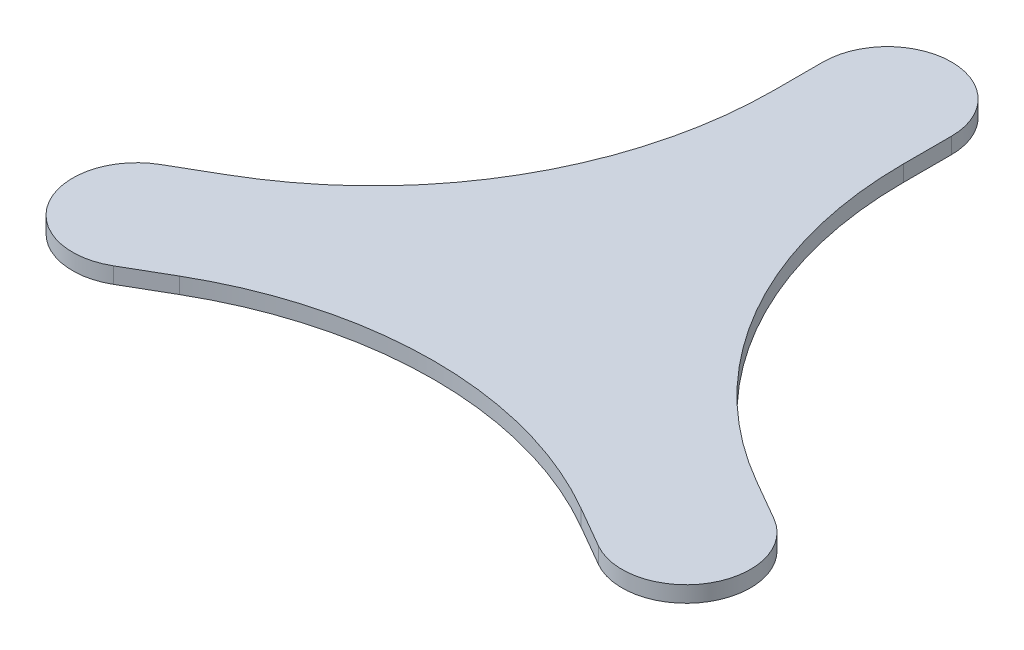
ISO-10303-21;
HEADER;
FILE_DESCRIPTION(('STEP AP214'),'2;1');
FILE_NAME('part.step','',(''),(''),'','','');
FILE_SCHEMA(('AUTOMOTIVE_DESIGN { 1 0 10303 214 1 1 1 1 }'));
ENDSEC;
DATA;
#1=APPLICATION_CONTEXT('core data for automotive mechanical design processes');
#2=APPLICATION_PROTOCOL_DEFINITION('international standard','automotive_design',2000,#1);
#3=PRODUCT_CONTEXT('',#1,'mechanical');
#4=PRODUCT('Part','Part','',(#3));
#5=PRODUCT_RELATED_PRODUCT_CATEGORY('part','',(#4));
#6=PRODUCT_DEFINITION_FORMATION('','',#4);
#7=PRODUCT_DEFINITION_CONTEXT('part definition',#1,'design');
#8=PRODUCT_DEFINITION('design','',#6,#7);
#9=PRODUCT_DEFINITION_SHAPE('','',#8);
#10=(LENGTH_UNIT() NAMED_UNIT(*) SI_UNIT(.MILLI.,.METRE.));
#11=(NAMED_UNIT(*) PLANE_ANGLE_UNIT() SI_UNIT($,.RADIAN.));
#12=(NAMED_UNIT(*) SI_UNIT($,.STERADIAN.) SOLID_ANGLE_UNIT());
#13=UNCERTAINTY_MEASURE_WITH_UNIT(LENGTH_MEASURE(1.E-05),#10,'distance_accuracy_value','');
#14=(GEOMETRIC_REPRESENTATION_CONTEXT(3) GLOBAL_UNCERTAINTY_ASSIGNED_CONTEXT((#13)) GLOBAL_UNIT_ASSIGNED_CONTEXT((#10,
#11,#12)) REPRESENTATION_CONTEXT('',''));
#15=CARTESIAN_POINT('',(0.,0.,0.));
#16=DIRECTION('',(0.,0.,1.));
#17=DIRECTION('',(1.,0.,0.));
#18=AXIS2_PLACEMENT_3D('',#15,#16,#17);
#19=CARTESIAN_POINT('',(-124.999999999999,10.,118.356805183872));
#20=DIRECTION('',(0.499999999999996,0.,0.866025403784441));
#21=DIRECTION('',(0.866025403784441,0.,-0.499999999999996));
#22=AXIS2_PLACEMENT_3D('',#19,#20,#21);
#23=PLANE('',#22);
#24=DIRECTION('',(-0.866025403784441,0.,0.499999999999996));
#25=VECTOR('',#24,1.);
#26=CARTESIAN_POINT('',(-124.999999999999,0.,118.356805183872));
#27=LINE('',#26,#25);
#28=CARTESIAN_POINT('',(-124.999999999999,0.,118.356805183872));
#29=VERTEX_POINT('',#28);
#30=CARTESIAN_POINT('',(-151.040017247427,0.,133.391016151377));
#31=VERTEX_POINT('',#30);
#32=EDGE_CURVE('E159',#29,#31,#27,.T.);
#33=ORIENTED_EDGE('',*,*,#32,.F.);
#34=DIRECTION('',(0.,-1.,0.));
#35=VECTOR('',#34,1.);
#36=CARTESIAN_POINT('',(-124.999999999999,10.,118.356805183872));
#37=LINE('',#36,#35);
#38=CARTESIAN_POINT('',(-124.999999999999,10.,118.356805183872));
#39=VERTEX_POINT('',#38);
#40=EDGE_CURVE('E11',#39,#29,#37,.T.);
#41=ORIENTED_EDGE('',*,*,#40,.F.);
#42=DIRECTION('',(-0.866025403784441,0.,0.499999999999996));
#43=VECTOR('',#42,1.);
#44=CARTESIAN_POINT('',(-124.999999999999,10.,118.356805183872));
#45=LINE('',#44,#43);
#46=CARTESIAN_POINT('',(-151.040017247427,10.,133.391016151377));
#47=VERTEX_POINT('',#46);
#48=EDGE_CURVE('E185',#39,#47,#45,.T.);
#49=ORIENTED_EDGE('',*,*,#48,.T.);
#50=DIRECTION('',(0.,-1.,0.));
#51=VECTOR('',#50,1.);
#52=CARTESIAN_POINT('',(-151.040017247427,10.,133.391016151377));
#53=LINE('',#52,#51);
#54=EDGE_CURVE('E40',#47,#31,#53,.T.);
#55=ORIENTED_EDGE('',*,*,#54,.T.);
#56=EDGE_LOOP('',(#33,#41,#49,#55));
#57=FACE_BOUND('',#56,.T.);
#58=ADVANCED_FACE('F37',(#57),#23,.T.);
#59=CARTESIAN_POINT('',(0.,10.,334.863156129982));
#60=DIRECTION('',(0.,-1.,0.));
#61=DIRECTION('',(0.,0.,-1.));
#62=AXIS2_PLACEMENT_3D('',#59,#60,#61);
#63=CYLINDRICAL_SURFACE('',#62,250.);
#64=CARTESIAN_POINT('',(0.,0.,334.863156129982));
#65=DIRECTION('',(0.,-1.,0.));
#66=DIRECTION('',(0.,0.,-1.));
#67=AXIS2_PLACEMENT_3D('',#64,#65,#66);
#68=CIRCLE('',#67,250.);
#69=CARTESIAN_POINT('',(125.,0.,118.356805183873));
#70=VERTEX_POINT('',#69);
#71=EDGE_CURVE('E94',#29,#70,#68,.T.);
#72=ORIENTED_EDGE('',*,*,#71,.T.);
#73=DIRECTION('',(0.,-1.,0.));
#74=VECTOR('',#73,1.);
#75=CARTESIAN_POINT('',(125.,10.,118.356805183873));
#76=LINE('',#75,#74);
#77=CARTESIAN_POINT('',(125.,10.,118.356805183873));
#78=VERTEX_POINT('',#77);
#79=EDGE_CURVE('E46',#78,#70,#76,.T.);
#80=ORIENTED_EDGE('',*,*,#79,.F.);
#81=CARTESIAN_POINT('',(0.,10.,334.863156129982));
#82=DIRECTION('',(0.,-1.,0.));
#83=DIRECTION('',(0.,0.,-1.));
#84=AXIS2_PLACEMENT_3D('',#81,#82,#83);
#85=CIRCLE('',#84,250.);
#86=EDGE_CURVE('E137',#39,#78,#85,.T.);
#87=ORIENTED_EDGE('',*,*,#86,.F.);
#88=ORIENTED_EDGE('',*,*,#40,.T.);
#89=EDGE_LOOP('',(#72,#80,#87,#88));
#90=FACE_BOUND('',#89,.T.);
#91=ADVANCED_FACE('F264',(#90),#63,.F.);
#92=CARTESIAN_POINT('',(125.000000000001,10.,118.356805183873));
#93=DIRECTION('',(0.500000000000003,0.,-0.866025403784437));
#94=DIRECTION('',(-0.866025403784437,0.,-0.500000000000003));
#95=AXIS2_PLACEMENT_3D('',#92,#93,#94);
#96=PLANE('',#95);
#97=DIRECTION('',(0.866025403784437,0.,0.500000000000003));
#98=VECTOR('',#97,1.);
#99=CARTESIAN_POINT('',(125.000000000001,0.,118.356805183873));
#100=LINE('',#99,#98);
#101=CARTESIAN_POINT('',(151.040017247427,0.,133.391016151377));
#102=VERTEX_POINT('',#101);
#103=EDGE_CURVE('E144',#70,#102,#100,.T.);
#104=ORIENTED_EDGE('',*,*,#103,.T.);
#105=DIRECTION('',(0.,-1.,0.));
#106=VECTOR('',#105,1.);
#107=CARTESIAN_POINT('',(151.040017247427,10.,133.391016151377));
#108=LINE('',#107,#106);
#109=CARTESIAN_POINT('',(151.040017247427,10.,133.391016151377));
#110=VERTEX_POINT('',#109);
#111=EDGE_CURVE('E141',#110,#102,#108,.T.);
#112=ORIENTED_EDGE('',*,*,#111,.F.);
#113=DIRECTION('',(0.866025403784437,0.,0.500000000000003));
#114=VECTOR('',#113,1.);
#115=CARTESIAN_POINT('',(125.000000000001,10.,118.356805183873));
#116=LINE('',#115,#114);
#117=EDGE_CURVE('E130',#78,#110,#116,.T.);
#118=ORIENTED_EDGE('',*,*,#117,.F.);
#119=ORIENTED_EDGE('',*,*,#79,.T.);
#120=EDGE_LOOP('',(#104,#112,#118,#119));
#121=FACE_BOUND('',#120,.T.);
#122=ADVANCED_FACE('F142',(#121),#96,.F.);
#123=CARTESIAN_POINT('',(171.040017247427,10.,98.7499999999995));
#124=DIRECTION('',(0.,-1.,0.));
#125=DIRECTION('',(0.,0.,-1.));
#126=AXIS2_PLACEMENT_3D('',#123,#124,#125);
#127=CYLINDRICAL_SURFACE('',#126,40.0000000000001);
#128=CARTESIAN_POINT('',(171.040017247427,0.,98.7499999999995));
#129=DIRECTION('',(0.,1.,0.));
#130=DIRECTION('',(0.,0.,1.));
#131=AXIS2_PLACEMENT_3D('',#128,#129,#130);
#132=CIRCLE('',#131,40.0000000000001);
#133=CARTESIAN_POINT('',(191.040017247427,0.,64.1089838486219));
#134=VERTEX_POINT('',#133);
#135=EDGE_CURVE('E182',#102,#134,#132,.T.);
#136=ORIENTED_EDGE('',*,*,#135,.T.);
#137=DIRECTION('',(0.,-1.,0.));
#138=VECTOR('',#137,1.);
#139=CARTESIAN_POINT('',(191.040017247427,10.,64.1089838486219));
#140=LINE('',#139,#138);
#141=CARTESIAN_POINT('',(191.040017247427,10.,64.1089838486219));
#142=VERTEX_POINT('',#141);
#143=EDGE_CURVE('E148',#142,#134,#140,.T.);
#144=ORIENTED_EDGE('',*,*,#143,.F.);
#145=CARTESIAN_POINT('',(171.040017247427,10.,98.7499999999995));
#146=DIRECTION('',(0.,1.,0.));
#147=DIRECTION('',(0.,0.,1.));
#148=AXIS2_PLACEMENT_3D('',#145,#146,#147);
#149=CIRCLE('',#148,40.0000000000001);
#150=EDGE_CURVE('E135',#110,#142,#149,.T.);
#151=ORIENTED_EDGE('',*,*,#150,.F.);
#152=ORIENTED_EDGE('',*,*,#111,.T.);
#153=EDGE_LOOP('',(#136,#144,#151,#152));
#154=FACE_BOUND('',#153,.T.);
#155=ADVANCED_FACE('F150',(#154),#127,.T.);
#156=CARTESIAN_POINT('',(165.000000000001,10.,49.074772881118));
#157=DIRECTION('',(0.499999999999996,0.,-0.866025403784441));
#158=DIRECTION('',(-0.866025403784441,0.,-0.499999999999996));
#159=AXIS2_PLACEMENT_3D('',#156,#157,#158);
#160=PLANE('',#159);
#161=DIRECTION('',(0.866025403784441,0.,0.499999999999996));
#162=VECTOR('',#161,1.);
#163=CARTESIAN_POINT('',(165.000000000001,0.,49.074772881118));
#164=LINE('',#163,#162);
#165=CARTESIAN_POINT('',(165.000000000001,0.,49.074772881118));
#166=VERTEX_POINT('',#165);
#167=EDGE_CURVE('E179',#166,#134,#164,.T.);
#168=ORIENTED_EDGE('',*,*,#167,.F.);
#169=DIRECTION('',(0.,-1.,0.));
#170=VECTOR('',#169,1.);
#171=CARTESIAN_POINT('',(165.000000000001,10.,49.074772881118));
#172=LINE('',#171,#170);
#173=CARTESIAN_POINT('',(165.000000000001,10.,49.074772881118));
#174=VERTEX_POINT('',#173);
#175=EDGE_CURVE('E189',#174,#166,#172,.T.);
#176=ORIENTED_EDGE('',*,*,#175,.F.);
#177=DIRECTION('',(0.866025403784441,0.,0.499999999999996));
#178=VECTOR('',#177,1.);
#179=CARTESIAN_POINT('',(165.000000000001,10.,49.074772881118));
#180=LINE('',#179,#178);
#181=EDGE_CURVE('E152',#174,#142,#180,.T.);
#182=ORIENTED_EDGE('',*,*,#181,.T.);
#183=ORIENTED_EDGE('',*,*,#143,.T.);
#184=EDGE_LOOP('',(#168,#176,#182,#183));
#185=FACE_BOUND('',#184,.T.);
#186=ADVANCED_FACE('F215',(#185),#160,.T.);
#187=CARTESIAN_POINT('',(290.,10.,-167.431578064992));
#188=DIRECTION('',(0.,-1.,0.));
#189=DIRECTION('',(0.,0.,-1.));
#190=AXIS2_PLACEMENT_3D('',#187,#188,#189);
#191=CYLINDRICAL_SURFACE('',#190,250.);
#192=CARTESIAN_POINT('',(290.,0.,-167.431578064992));
#193=DIRECTION('',(0.,1.,0.));
#194=DIRECTION('',(0.,0.,1.));
#195=AXIS2_PLACEMENT_3D('',#192,#193,#194);
#196=CIRCLE('',#195,250.);
#197=CARTESIAN_POINT('',(40.,0.,-167.431578064992));
#198=VERTEX_POINT('',#197);
#199=EDGE_CURVE('E176',#198,#166,#196,.T.);
#200=ORIENTED_EDGE('',*,*,#199,.F.);
#201=DIRECTION('',(0.,-1.,0.));
#202=VECTOR('',#201,1.);
#203=CARTESIAN_POINT('',(40.,10.,-167.431578064992));
#204=LINE('',#203,#202);
#205=CARTESIAN_POINT('',(40.,10.,-167.431578064992));
#206=VERTEX_POINT('',#205);
#207=EDGE_CURVE('E191',#206,#198,#204,.T.);
#208=ORIENTED_EDGE('',*,*,#207,.F.);
#209=CARTESIAN_POINT('',(290.,10.,-167.431578064992));
#210=DIRECTION('',(0.,1.,0.));
#211=DIRECTION('',(0.,0.,1.));
#212=AXIS2_PLACEMENT_3D('',#209,#210,#211);
#213=CIRCLE('',#212,250.);
#214=EDGE_CURVE('E154',#206,#174,#213,.T.);
#215=ORIENTED_EDGE('',*,*,#214,.T.);
#216=ORIENTED_EDGE('',*,*,#175,.T.);
#217=EDGE_LOOP('',(#200,#208,#215,#216));
#218=FACE_BOUND('',#217,.T.);
#219=ADVANCED_FACE('F221',(#218),#191,.F.);
#220=CARTESIAN_POINT('',(40.,10.,-197.5));
#221=DIRECTION('',(1.,0.,0.));
#222=DIRECTION('',(0.,0.,-1.));
#223=AXIS2_PLACEMENT_3D('',#220,#221,#222);
#224=PLANE('',#223);
#225=DIRECTION('',(0.,0.,1.));
#226=VECTOR('',#225,1.);
#227=CARTESIAN_POINT('',(40.,0.,-197.5));
#228=LINE('',#227,#226);
#229=CARTESIAN_POINT('',(40.,0.,-197.5));
#230=VERTEX_POINT('',#229);
#231=EDGE_CURVE('E173',#230,#198,#228,.T.);
#232=ORIENTED_EDGE('',*,*,#231,.F.);
#233=DIRECTION('',(0.,-1.,0.));
#234=VECTOR('',#233,1.);
#235=CARTESIAN_POINT('',(40.,10.,-197.5));
#236=LINE('',#235,#234);
#237=CARTESIAN_POINT('',(40.,10.,-197.5));
#238=VERTEX_POINT('',#237);
#239=EDGE_CURVE('E193',#238,#230,#236,.T.);
#240=ORIENTED_EDGE('',*,*,#239,.F.);
#241=DIRECTION('',(0.,0.,1.));
#242=VECTOR('',#241,1.);
#243=CARTESIAN_POINT('',(40.,10.,-197.5));
#244=LINE('',#243,#242);
#245=EDGE_CURVE('E222',#238,#206,#244,.T.);
#246=ORIENTED_EDGE('',*,*,#245,.T.);
#247=ORIENTED_EDGE('',*,*,#207,.T.);
#248=EDGE_LOOP('',(#232,#240,#246,#247));
#249=FACE_BOUND('',#248,.T.);
#250=ADVANCED_FACE('F254',(#249),#224,.T.);
#251=CARTESIAN_POINT('',(0.,10.,-197.5));
#252=DIRECTION('',(0.,-1.,0.));
#253=DIRECTION('',(0.,0.,-1.));
#254=AXIS2_PLACEMENT_3D('',#251,#252,#253);
#255=CYLINDRICAL_SURFACE('',#254,40.);
#256=CARTESIAN_POINT('',(0.,0.,-197.5));
#257=DIRECTION('',(0.,1.,0.));
#258=DIRECTION('',(0.,0.,1.));
#259=AXIS2_PLACEMENT_3D('',#256,#257,#258);
#260=CIRCLE('',#259,40.);
#261=CARTESIAN_POINT('',(-40.,0.,-197.5));
#262=VERTEX_POINT('',#261);
#263=EDGE_CURVE('E171',#230,#262,#260,.T.);
#264=ORIENTED_EDGE('',*,*,#263,.T.);
#265=DIRECTION('',(0.,-1.,0.));
#266=VECTOR('',#265,1.);
#267=CARTESIAN_POINT('',(-40.,10.,-197.5));
#268=LINE('',#267,#266);
#269=CARTESIAN_POINT('',(-40.,10.,-197.5));
#270=VERTEX_POINT('',#269);
#271=EDGE_CURVE('E195',#270,#262,#268,.T.);
#272=ORIENTED_EDGE('',*,*,#271,.F.);
#273=CARTESIAN_POINT('',(0.,10.,-197.5));
#274=DIRECTION('',(0.,1.,0.));
#275=DIRECTION('',(0.,0.,1.));
#276=AXIS2_PLACEMENT_3D('',#273,#274,#275);
#277=CIRCLE('',#276,40.);
#278=EDGE_CURVE('E223',#238,#270,#277,.T.);
#279=ORIENTED_EDGE('',*,*,#278,.F.);
#280=ORIENTED_EDGE('',*,*,#239,.T.);
#281=EDGE_LOOP('',(#264,#272,#279,#280));
#282=FACE_BOUND('',#281,.T.);
#283=ADVANCED_FACE('F251',(#282),#255,.T.);
#284=CARTESIAN_POINT('',(-40.,10.,-197.5));
#285=DIRECTION('',(1.,0.,0.));
#286=DIRECTION('',(0.,0.,-1.));
#287=AXIS2_PLACEMENT_3D('',#284,#285,#286);
#288=PLANE('',#287);
#289=DIRECTION('',(0.,0.,1.));
#290=VECTOR('',#289,1.);
#291=CARTESIAN_POINT('',(-40.,0.,-197.5));
#292=LINE('',#291,#290);
#293=CARTESIAN_POINT('',(-40.,0.,-167.431578064992));
#294=VERTEX_POINT('',#293);
#295=EDGE_CURVE('E169',#262,#294,#292,.T.);
#296=ORIENTED_EDGE('',*,*,#295,.T.);
#297=DIRECTION('',(0.,-1.,0.));
#298=VECTOR('',#297,1.);
#299=CARTESIAN_POINT('',(-40.,10.,-167.431578064992));
#300=LINE('',#299,#298);
#301=CARTESIAN_POINT('',(-40.,10.,-167.431578064992));
#302=VERTEX_POINT('',#301);
#303=EDGE_CURVE('E198',#302,#294,#300,.T.);
#304=ORIENTED_EDGE('',*,*,#303,.F.);
#305=DIRECTION('',(0.,0.,1.));
#306=VECTOR('',#305,1.);
#307=CARTESIAN_POINT('',(-40.,10.,-197.5));
#308=LINE('',#307,#306);
#309=EDGE_CURVE('E227',#270,#302,#308,.T.);
#310=ORIENTED_EDGE('',*,*,#309,.F.);
#311=ORIENTED_EDGE('',*,*,#271,.T.);
#312=EDGE_LOOP('',(#296,#304,#310,#311));
#313=FACE_BOUND('',#312,.T.);
#314=ADVANCED_FACE('F247',(#313),#288,.F.);
#315=CARTESIAN_POINT('',(-290.,10.,-167.431578064992));
#316=DIRECTION('',(0.,-1.,0.));
#317=DIRECTION('',(0.,0.,-1.));
#318=AXIS2_PLACEMENT_3D('',#315,#316,#317);
#319=CYLINDRICAL_SURFACE('',#318,250.);
#320=CARTESIAN_POINT('',(-290.,0.,-167.431578064992));
#321=DIRECTION('',(0.,-1.,0.));
#322=DIRECTION('',(0.,0.,-1.));
#323=AXIS2_PLACEMENT_3D('',#320,#321,#322);
#324=CIRCLE('',#323,250.);
#325=CARTESIAN_POINT('',(-165.,0.,49.074772881118));
#326=VERTEX_POINT('',#325);
#327=EDGE_CURVE('E167',#294,#326,#324,.T.);
#328=ORIENTED_EDGE('',*,*,#327,.T.);
#329=DIRECTION('',(0.,-1.,0.));
#330=VECTOR('',#329,1.);
#331=CARTESIAN_POINT('',(-165.,10.,49.074772881118));
#332=LINE('',#331,#330);
#333=CARTESIAN_POINT('',(-165.,10.,49.074772881118));
#334=VERTEX_POINT('',#333);
#335=EDGE_CURVE('E201',#334,#326,#332,.T.);
#336=ORIENTED_EDGE('',*,*,#335,.F.);
#337=CARTESIAN_POINT('',(-290.,10.,-167.431578064992));
#338=DIRECTION('',(0.,-1.,0.));
#339=DIRECTION('',(0.,0.,-1.));
#340=AXIS2_PLACEMENT_3D('',#337,#338,#339);
#341=CIRCLE('',#340,250.);
#342=EDGE_CURVE('E229',#302,#334,#341,.T.);
#343=ORIENTED_EDGE('',*,*,#342,.F.);
#344=ORIENTED_EDGE('',*,*,#303,.T.);
#345=EDGE_LOOP('',(#328,#336,#343,#344));
#346=FACE_BOUND('',#345,.T.);
#347=ADVANCED_FACE('F243',(#346),#319,.F.);
#348=CARTESIAN_POINT('',(-165.000000000001,10.,49.074772881118));
#349=DIRECTION('',(0.500000000000001,0.,0.866025403784438));
#350=DIRECTION('',(0.866025403784438,0.,-0.500000000000001));
#351=AXIS2_PLACEMENT_3D('',#348,#349,#350);
#352=PLANE('',#351);
#353=DIRECTION('',(-0.866025403784438,0.,0.500000000000001));
#354=VECTOR('',#353,1.);
#355=CARTESIAN_POINT('',(-165.000000000001,0.,49.074772881118));
#356=LINE('',#355,#354);
#357=CARTESIAN_POINT('',(-191.040017247427,0.,64.1089838486221));
#358=VERTEX_POINT('',#357);
#359=EDGE_CURVE('E165',#326,#358,#356,.T.);
#360=ORIENTED_EDGE('',*,*,#359,.T.);
#361=DIRECTION('',(0.,-1.,0.));
#362=VECTOR('',#361,1.);
#363=CARTESIAN_POINT('',(-191.040017247427,10.,64.1089838486221));
#364=LINE('',#363,#362);
#365=CARTESIAN_POINT('',(-191.040017247427,10.,64.1089838486221));
#366=VERTEX_POINT('',#365);
#367=EDGE_CURVE('E203',#366,#358,#364,.T.);
#368=ORIENTED_EDGE('',*,*,#367,.F.);
#369=DIRECTION('',(-0.866025403784438,0.,0.500000000000001));
#370=VECTOR('',#369,1.);
#371=CARTESIAN_POINT('',(-165.000000000001,10.,49.074772881118));
#372=LINE('',#371,#370);
#373=EDGE_CURVE('E231',#334,#366,#372,.T.);
#374=ORIENTED_EDGE('',*,*,#373,.F.);
#375=ORIENTED_EDGE('',*,*,#335,.T.);
#376=EDGE_LOOP('',(#360,#368,#374,#375));
#377=FACE_BOUND('',#376,.T.);
#378=ADVANCED_FACE('F238',(#377),#352,.F.);
#379=CARTESIAN_POINT('',(-171.040017247427,10.,98.7499999999997));
#380=DIRECTION('',(0.,-1.,0.));
#381=DIRECTION('',(0.,0.,-1.));
#382=AXIS2_PLACEMENT_3D('',#379,#380,#381);
#383=CYLINDRICAL_SURFACE('',#382,40.);
#384=CARTESIAN_POINT('',(-171.040017247427,0.,98.7499999999997));
#385=DIRECTION('',(0.,1.,0.));
#386=DIRECTION('',(0.,0.,1.));
#387=AXIS2_PLACEMENT_3D('',#384,#385,#386);
#388=CIRCLE('',#387,40.);
#389=EDGE_CURVE('E162',#358,#31,#388,.T.);
#390=ORIENTED_EDGE('',*,*,#389,.T.);
#391=ORIENTED_EDGE('',*,*,#54,.F.);
#392=CARTESIAN_POINT('',(-171.040017247427,10.,98.7499999999997));
#393=DIRECTION('',(0.,1.,0.));
#394=DIRECTION('',(0.,0.,1.));
#395=AXIS2_PLACEMENT_3D('',#392,#393,#394);
#396=CIRCLE('',#395,40.);
#397=EDGE_CURVE('E104',#366,#47,#396,.T.);
#398=ORIENTED_EDGE('',*,*,#397,.F.);
#399=ORIENTED_EDGE('',*,*,#367,.T.);
#400=EDGE_LOOP('',(#390,#391,#398,#399));
#401=FACE_BOUND('',#400,.T.);
#402=ADVANCED_FACE('F208',(#401),#383,.T.);
#403=CARTESIAN_POINT('',(-171.040017247427,10.,98.7499999999997));
#404=DIRECTION('',(0.,1.,0.));
#405=DIRECTION('',(0.,0.,1.));
#406=AXIS2_PLACEMENT_3D('',#403,#404,#405);
#407=PLANE('',#406);
#408=ORIENTED_EDGE('',*,*,#48,.F.);
#409=ORIENTED_EDGE('',*,*,#86,.T.);
#410=ORIENTED_EDGE('',*,*,#117,.T.);
#411=ORIENTED_EDGE('',*,*,#150,.T.);
#412=ORIENTED_EDGE('',*,*,#181,.F.);
#413=ORIENTED_EDGE('',*,*,#214,.F.);
#414=ORIENTED_EDGE('',*,*,#245,.F.);
#415=ORIENTED_EDGE('',*,*,#278,.T.);
#416=ORIENTED_EDGE('',*,*,#309,.T.);
#417=ORIENTED_EDGE('',*,*,#342,.T.);
#418=ORIENTED_EDGE('',*,*,#373,.T.);
#419=ORIENTED_EDGE('',*,*,#397,.T.);
#420=EDGE_LOOP('',(#408,#409,#410,#411,#412,#413,#414,#415,#416,#417,#418,#419));
#421=FACE_BOUND('',#420,.T.);
#422=ADVANCED_FACE('F132',(#421),#407,.T.);
#423=CARTESIAN_POINT('',(-171.040017247427,0.,98.7499999999997));
#424=DIRECTION('',(0.,1.,0.));
#425=DIRECTION('',(0.,0.,1.));
#426=AXIS2_PLACEMENT_3D('',#423,#424,#425);
#427=PLANE('',#426);
#428=ORIENTED_EDGE('',*,*,#32,.T.);
#429=ORIENTED_EDGE('',*,*,#389,.F.);
#430=ORIENTED_EDGE('',*,*,#359,.F.);
#431=ORIENTED_EDGE('',*,*,#327,.F.);
#432=ORIENTED_EDGE('',*,*,#295,.F.);
#433=ORIENTED_EDGE('',*,*,#263,.F.);
#434=ORIENTED_EDGE('',*,*,#231,.T.);
#435=ORIENTED_EDGE('',*,*,#199,.T.);
#436=ORIENTED_EDGE('',*,*,#167,.T.);
#437=ORIENTED_EDGE('',*,*,#135,.F.);
#438=ORIENTED_EDGE('',*,*,#103,.F.);
#439=ORIENTED_EDGE('',*,*,#71,.F.);
#440=EDGE_LOOP('',(#428,#429,#430,#431,#432,#433,#434,#435,#436,#437,#438,#439));
#441=FACE_BOUND('',#440,.T.);
#442=ADVANCED_FACE('F211',(#441),#427,.F.);
#443=CLOSED_SHELL('',(#58,#91,#122,#155,#186,#219,#250,#283,#314,#347,#378,#402,#422,#442));
#444=MANIFOLD_SOLID_BREP('B2',#443);
#445=ADVANCED_BREP_SHAPE_REPRESENTATION('',(#18,#444),#14);
#446=SHAPE_DEFINITION_REPRESENTATION(#9,#445);
ENDSEC;
END-ISO-10303-21;
